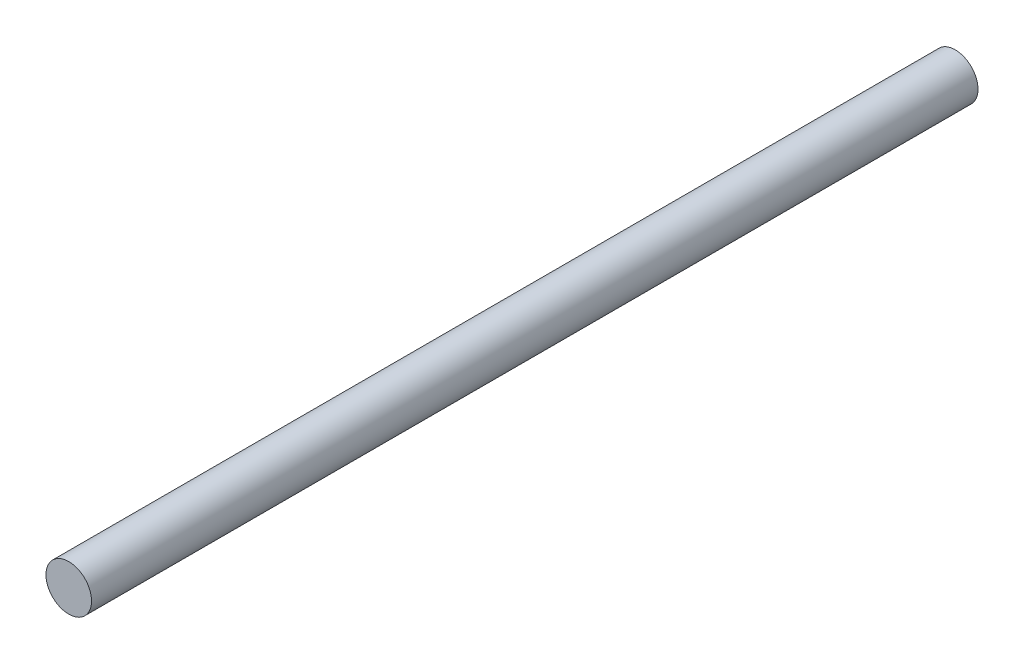
ISO-10303-21;
HEADER;
FILE_DESCRIPTION(('STEP AP214'),'2;1');
FILE_NAME('part.step','',(''),(''),'','','');
FILE_SCHEMA(('AUTOMOTIVE_DESIGN { 1 0 10303 214 1 1 1 1 }'));
ENDSEC;
DATA;
#1=APPLICATION_CONTEXT('core data for automotive mechanical design processes');
#2=APPLICATION_PROTOCOL_DEFINITION('international standard','automotive_design',2000,#1);
#3=PRODUCT_CONTEXT('',#1,'mechanical');
#4=PRODUCT('Part','Part','',(#3));
#5=PRODUCT_RELATED_PRODUCT_CATEGORY('part','',(#4));
#6=PRODUCT_DEFINITION_FORMATION('','',#4);
#7=PRODUCT_DEFINITION_CONTEXT('part definition',#1,'design');
#8=PRODUCT_DEFINITION('design','',#6,#7);
#9=PRODUCT_DEFINITION_SHAPE('','',#8);
#10=(LENGTH_UNIT() NAMED_UNIT(*) SI_UNIT(.MILLI.,.METRE.));
#11=(NAMED_UNIT(*) PLANE_ANGLE_UNIT() SI_UNIT($,.RADIAN.));
#12=(NAMED_UNIT(*) SI_UNIT($,.STERADIAN.) SOLID_ANGLE_UNIT());
#13=UNCERTAINTY_MEASURE_WITH_UNIT(LENGTH_MEASURE(1.E-05),#10,'distance_accuracy_value','');
#14=(GEOMETRIC_REPRESENTATION_CONTEXT(3) GLOBAL_UNCERTAINTY_ASSIGNED_CONTEXT((#13)) GLOBAL_UNIT_ASSIGNED_CONTEXT((#10,
#11,#12)) REPRESENTATION_CONTEXT('',''));
#15=CARTESIAN_POINT('',(0.,0.,0.));
#16=DIRECTION('',(0.,0.,1.));
#17=DIRECTION('',(1.,0.,0.));
#18=AXIS2_PLACEMENT_3D('',#15,#16,#17);
#19=CARTESIAN_POINT('',(0.,0.,66.675));
#20=DIRECTION('',(0.,0.,-1.));
#21=DIRECTION('',(-1.,0.,0.));
#22=AXIS2_PLACEMENT_3D('',#19,#20,#21);
#23=CYLINDRICAL_SURFACE('',#22,3.429);
#24=CARTESIAN_POINT('',(0.,0.,66.675));
#25=DIRECTION('',(0.,0.,1.));
#26=DIRECTION('',(1.,0.,0.));
#27=AXIS2_PLACEMENT_3D('',#24,#25,#26);
#28=CIRCLE('',#27,3.429);
#29=CARTESIAN_POINT('',(3.429,0.,66.675));
#30=VERTEX_POINT('',#29);
#31=EDGE_CURVE('E10',#30,#30,#28,.T.);
#32=ORIENTED_EDGE('',*,*,#31,.F.);
#33=EDGE_LOOP('',(#32));
#34=FACE_BOUND('',#33,.T.);
#35=CARTESIAN_POINT('',(0.,0.,-66.675));
#36=DIRECTION('',(0.,0.,1.));
#37=DIRECTION('',(1.,0.,0.));
#38=AXIS2_PLACEMENT_3D('',#35,#36,#37);
#39=CIRCLE('',#38,3.429);
#40=CARTESIAN_POINT('',(3.429,0.,-66.675));
#41=VERTEX_POINT('',#40);
#42=EDGE_CURVE('E40',#41,#41,#39,.T.);
#43=ORIENTED_EDGE('',*,*,#42,.T.);
#44=EDGE_LOOP('',(#43));
#45=FACE_BOUND('',#44,.T.);
#46=ADVANCED_FACE('F37',(#34,#45),#23,.T.);
#47=CARTESIAN_POINT('',(0.,0.,66.675));
#48=DIRECTION('',(0.,0.,1.));
#49=DIRECTION('',(1.,0.,0.));
#50=AXIS2_PLACEMENT_3D('',#47,#48,#49);
#51=PLANE('',#50);
#52=ORIENTED_EDGE('',*,*,#31,.T.);
#53=EDGE_LOOP('',(#52));
#54=FACE_BOUND('',#53,.T.);
#55=ADVANCED_FACE('F52',(#54),#51,.T.);
#56=CARTESIAN_POINT('',(0.,0.,-66.675));
#57=DIRECTION('',(0.,0.,1.));
#58=DIRECTION('',(1.,0.,0.));
#59=AXIS2_PLACEMENT_3D('',#56,#57,#58);
#60=PLANE('',#59);
#61=ORIENTED_EDGE('',*,*,#42,.F.);
#62=EDGE_LOOP('',(#61));
#63=FACE_BOUND('',#62,.T.);
#64=ADVANCED_FACE('F50',(#63),#60,.F.);
#65=CLOSED_SHELL('',(#46,#55,#64));
#66=MANIFOLD_SOLID_BREP('B2',#65);
#67=ADVANCED_BREP_SHAPE_REPRESENTATION('',(#18,#66),#14);
#68=SHAPE_DEFINITION_REPRESENTATION(#9,#67);
ENDSEC;
END-ISO-10303-21;
